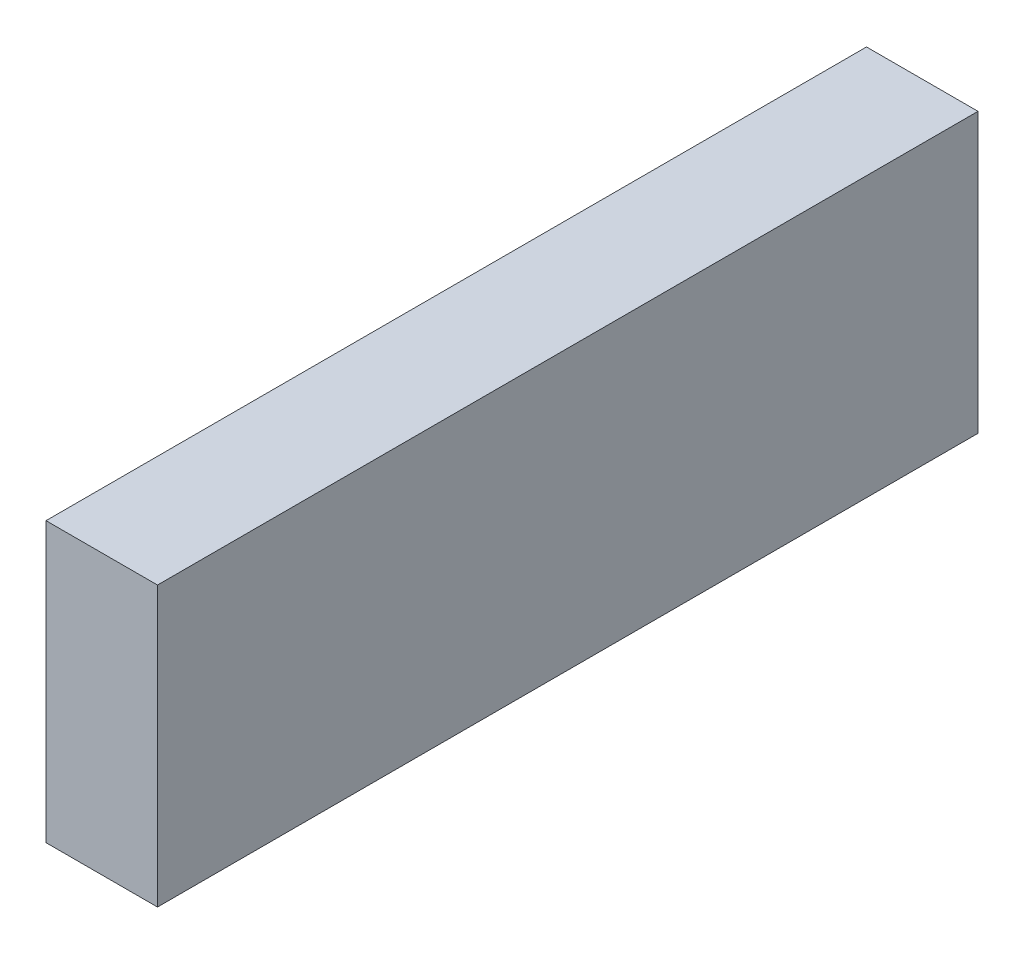
ISO-10303-21;
HEADER;
FILE_DESCRIPTION(('STEP AP214'),'2;1');
FILE_NAME('part.step','',(''),(''),'','','');
FILE_SCHEMA(('AUTOMOTIVE_DESIGN { 1 0 10303 214 1 1 1 1 }'));
ENDSEC;
DATA;
#1=APPLICATION_CONTEXT('core data for automotive mechanical design processes');
#2=APPLICATION_PROTOCOL_DEFINITION('international standard','automotive_design',2000,#1);
#3=PRODUCT_CONTEXT('',#1,'mechanical');
#4=PRODUCT('Part','Part','',(#3));
#5=PRODUCT_RELATED_PRODUCT_CATEGORY('part','',(#4));
#6=PRODUCT_DEFINITION_FORMATION('','',#4);
#7=PRODUCT_DEFINITION_CONTEXT('part definition',#1,'design');
#8=PRODUCT_DEFINITION('design','',#6,#7);
#9=PRODUCT_DEFINITION_SHAPE('','',#8);
#10=(LENGTH_UNIT() NAMED_UNIT(*) SI_UNIT(.MILLI.,.METRE.));
#11=(NAMED_UNIT(*) PLANE_ANGLE_UNIT() SI_UNIT($,.RADIAN.));
#12=(NAMED_UNIT(*) SI_UNIT($,.STERADIAN.) SOLID_ANGLE_UNIT());
#13=UNCERTAINTY_MEASURE_WITH_UNIT(LENGTH_MEASURE(1.E-05),#10,'distance_accuracy_value','');
#14=(GEOMETRIC_REPRESENTATION_CONTEXT(3) GLOBAL_UNCERTAINTY_ASSIGNED_CONTEXT((#13)) GLOBAL_UNIT_ASSIGNED_CONTEXT((#10,
#11,#12)) REPRESENTATION_CONTEXT('',''));
#15=CARTESIAN_POINT('',(0.,0.,0.));
#16=DIRECTION('',(0.,0.,1.));
#17=DIRECTION('',(1.,0.,0.));
#18=AXIS2_PLACEMENT_3D('',#15,#16,#17);
#19=CARTESIAN_POINT('',(24.3784584022022,1.,-5.59787413768714));
#20=DIRECTION('',(0.,0.,-1.));
#21=DIRECTION('',(-1.,0.,0.));
#22=AXIS2_PLACEMENT_3D('',#19,#20,#21);
#23=PLANE('',#22);
#24=DIRECTION('',(1.,0.,0.));
#25=VECTOR('',#24,1.);
#26=CARTESIAN_POINT('',(24.3784584022022,0.,-5.59787413768714));
#27=LINE('',#26,#25);
#28=CARTESIAN_POINT('',(24.3784584022022,0.,-5.59787413768714));
#29=VERTEX_POINT('',#28);
#30=CARTESIAN_POINT('',(24.7782520969688,0.,-5.59787413768714));
#31=VERTEX_POINT('',#30);
#32=EDGE_CURVE('E11',#29,#31,#27,.T.);
#33=ORIENTED_EDGE('',*,*,#32,.F.);
#34=DIRECTION('',(0.,-1.,0.));
#35=VECTOR('',#34,1.);
#36=CARTESIAN_POINT('',(24.3784584022022,1.,-5.59787413768714));
#37=LINE('',#36,#35);
#38=CARTESIAN_POINT('',(24.3784584022022,1.,-5.59787413768714));
#39=VERTEX_POINT('',#38);
#40=EDGE_CURVE('E85',#39,#29,#37,.T.);
#41=ORIENTED_EDGE('',*,*,#40,.F.);
#42=DIRECTION('',(1.,0.,0.));
#43=VECTOR('',#42,1.);
#44=CARTESIAN_POINT('',(24.3784584022022,1.,-5.59787413768714));
#45=LINE('',#44,#43);
#46=CARTESIAN_POINT('',(24.7782520969688,1.,-5.59787413768714));
#47=VERTEX_POINT('',#46);
#48=EDGE_CURVE('E43',#39,#47,#45,.T.);
#49=ORIENTED_EDGE('',*,*,#48,.T.);
#50=DIRECTION('',(0.,-1.,0.));
#51=VECTOR('',#50,1.);
#52=CARTESIAN_POINT('',(24.7782520969688,1.,-5.59787413768714));
#53=LINE('',#52,#51);
#54=EDGE_CURVE('E58',#47,#31,#53,.T.);
#55=ORIENTED_EDGE('',*,*,#54,.T.);
#56=EDGE_LOOP('',(#33,#41,#49,#55));
#57=FACE_BOUND('',#56,.T.);
#58=ADVANCED_FACE('F39',(#57),#23,.T.);
#59=CARTESIAN_POINT('',(24.3784584022022,1.,-5.59787413768714));
#60=DIRECTION('',(1.,0.,0.));
#61=DIRECTION('',(0.,0.,-1.));
#62=AXIS2_PLACEMENT_3D('',#59,#60,#61);
#63=PLANE('',#62);
#64=DIRECTION('',(0.,0.,1.));
#65=VECTOR('',#64,1.);
#66=CARTESIAN_POINT('',(24.3784584022022,0.,-5.59787413768714));
#67=LINE('',#66,#65);
#68=CARTESIAN_POINT('',(24.3784584022022,0.,-2.65580258902008));
#69=VERTEX_POINT('',#68);
#70=EDGE_CURVE('E88',#29,#69,#67,.T.);
#71=ORIENTED_EDGE('',*,*,#70,.T.);
#72=DIRECTION('',(0.,-1.,0.));
#73=VECTOR('',#72,1.);
#74=CARTESIAN_POINT('',(24.3784584022022,1.,-2.65580258902008));
#75=LINE('',#74,#73);
#76=CARTESIAN_POINT('',(24.3784584022022,1.,-2.65580258902008));
#77=VERTEX_POINT('',#76);
#78=EDGE_CURVE('E91',#77,#69,#75,.T.);
#79=ORIENTED_EDGE('',*,*,#78,.F.);
#80=DIRECTION('',(0.,0.,1.));
#81=VECTOR('',#80,1.);
#82=CARTESIAN_POINT('',(24.3784584022022,1.,-5.59787413768714));
#83=LINE('',#82,#81);
#84=EDGE_CURVE('E107',#39,#77,#83,.T.);
#85=ORIENTED_EDGE('',*,*,#84,.F.);
#86=ORIENTED_EDGE('',*,*,#40,.T.);
#87=EDGE_LOOP('',(#71,#79,#85,#86));
#88=FACE_BOUND('',#87,.T.);
#89=ADVANCED_FACE('F90',(#88),#63,.F.);
#90=CARTESIAN_POINT('',(24.3784584022022,1.,-2.65580258902008));
#91=DIRECTION('',(0.,0.,-1.));
#92=DIRECTION('',(-1.,0.,0.));
#93=AXIS2_PLACEMENT_3D('',#90,#91,#92);
#94=PLANE('',#93);
#95=DIRECTION('',(1.,0.,0.));
#96=VECTOR('',#95,1.);
#97=CARTESIAN_POINT('',(24.3784584022022,0.,-2.65580258902008));
#98=LINE('',#97,#96);
#99=CARTESIAN_POINT('',(24.7782520969688,0.,-2.65580258902008));
#100=VERTEX_POINT('',#99);
#101=EDGE_CURVE('E94',#69,#100,#98,.T.);
#102=ORIENTED_EDGE('',*,*,#101,.T.);
#103=DIRECTION('',(0.,-1.,0.));
#104=VECTOR('',#103,1.);
#105=CARTESIAN_POINT('',(24.7782520969688,1.,-2.65580258902008));
#106=LINE('',#105,#104);
#107=CARTESIAN_POINT('',(24.7782520969688,1.,-2.65580258902008));
#108=VERTEX_POINT('',#107);
#109=EDGE_CURVE('E100',#108,#100,#106,.T.);
#110=ORIENTED_EDGE('',*,*,#109,.F.);
#111=DIRECTION('',(1.,0.,0.));
#112=VECTOR('',#111,1.);
#113=CARTESIAN_POINT('',(24.3784584022022,1.,-2.65580258902008));
#114=LINE('',#113,#112);
#115=EDGE_CURVE('E75',#77,#108,#114,.T.);
#116=ORIENTED_EDGE('',*,*,#115,.F.);
#117=ORIENTED_EDGE('',*,*,#78,.T.);
#118=EDGE_LOOP('',(#102,#110,#116,#117));
#119=FACE_BOUND('',#118,.T.);
#120=ADVANCED_FACE('F98',(#119),#94,.F.);
#121=CARTESIAN_POINT('',(24.7782520969688,1.,-5.59787413768714));
#122=DIRECTION('',(1.,0.,0.));
#123=DIRECTION('',(0.,0.,-1.));
#124=AXIS2_PLACEMENT_3D('',#121,#122,#123);
#125=PLANE('',#124);
#126=DIRECTION('',(0.,0.,1.));
#127=VECTOR('',#126,1.);
#128=CARTESIAN_POINT('',(24.7782520969688,0.,-5.59787413768714));
#129=LINE('',#128,#127);
#130=EDGE_CURVE('E49',#31,#100,#129,.T.);
#131=ORIENTED_EDGE('',*,*,#130,.F.);
#132=ORIENTED_EDGE('',*,*,#54,.F.);
#133=DIRECTION('',(0.,0.,1.));
#134=VECTOR('',#133,1.);
#135=CARTESIAN_POINT('',(24.7782520969688,1.,-5.59787413768714));
#136=LINE('',#135,#134);
#137=EDGE_CURVE('E109',#47,#108,#136,.T.);
#138=ORIENTED_EDGE('',*,*,#137,.T.);
#139=ORIENTED_EDGE('',*,*,#109,.T.);
#140=EDGE_LOOP('',(#131,#132,#138,#139));
#141=FACE_BOUND('',#140,.T.);
#142=ADVANCED_FACE('F112',(#141),#125,.T.);
#143=CARTESIAN_POINT('',(0.,1.,0.));
#144=DIRECTION('',(0.,-1.,0.));
#145=DIRECTION('',(0.,0.,-1.));
#146=AXIS2_PLACEMENT_3D('',#143,#144,#145);
#147=PLANE('',#146);
#148=ORIENTED_EDGE('',*,*,#48,.F.);
#149=ORIENTED_EDGE('',*,*,#84,.T.);
#150=ORIENTED_EDGE('',*,*,#115,.T.);
#151=ORIENTED_EDGE('',*,*,#137,.F.);
#152=EDGE_LOOP('',(#148,#149,#150,#151));
#153=FACE_BOUND('',#152,.T.);
#154=ADVANCED_FACE('F41',(#153),#147,.F.);
#155=CARTESIAN_POINT('',(0.,0.,0.));
#156=DIRECTION('',(0.,-1.,0.));
#157=DIRECTION('',(0.,0.,-1.));
#158=AXIS2_PLACEMENT_3D('',#155,#156,#157);
#159=PLANE('',#158);
#160=ORIENTED_EDGE('',*,*,#32,.T.);
#161=ORIENTED_EDGE('',*,*,#130,.T.);
#162=ORIENTED_EDGE('',*,*,#101,.F.);
#163=ORIENTED_EDGE('',*,*,#70,.F.);
#164=EDGE_LOOP('',(#160,#161,#162,#163));
#165=FACE_BOUND('',#164,.T.);
#166=ADVANCED_FACE('F102',(#165),#159,.T.);
#167=CLOSED_SHELL('',(#58,#89,#120,#142,#154,#166));
#168=MANIFOLD_SOLID_BREP('B2',#167);
#169=ADVANCED_BREP_SHAPE_REPRESENTATION('',(#18,#168),#14);
#170=SHAPE_DEFINITION_REPRESENTATION(#9,#169);
ENDSEC;
END-ISO-10303-21;
